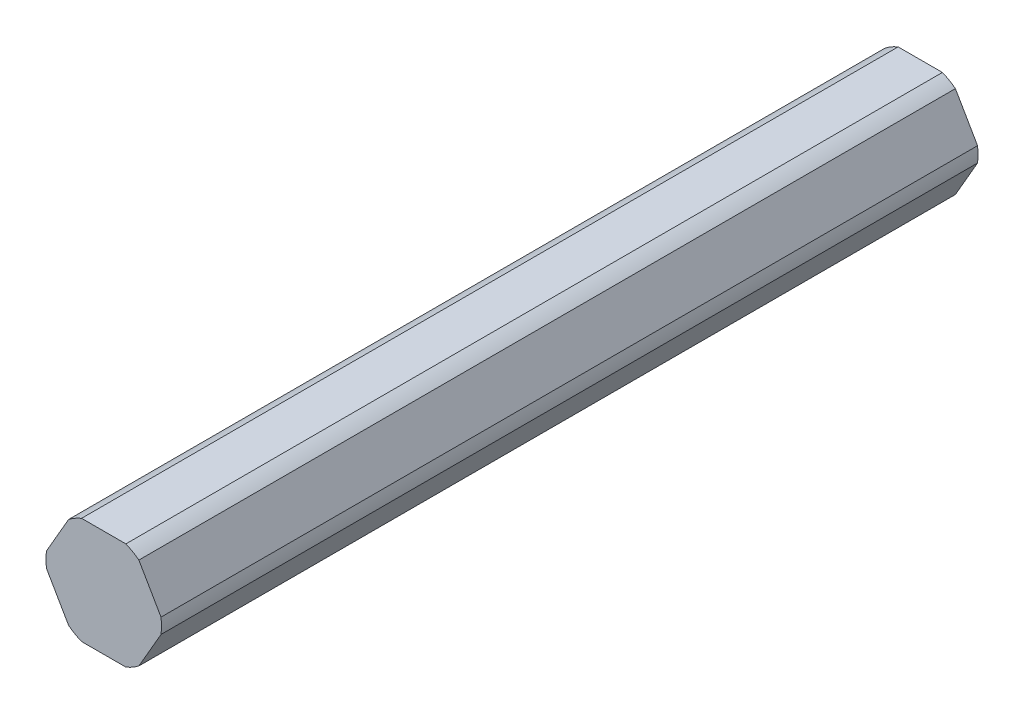
ISO-10303-21;
HEADER;
FILE_DESCRIPTION(('STEP AP214'),'2;1');
FILE_NAME('part.step','',(''),(''),'','','');
FILE_SCHEMA(('AUTOMOTIVE_DESIGN { 1 0 10303 214 1 1 1 1 }'));
ENDSEC;
DATA;
#1=APPLICATION_CONTEXT('core data for automotive mechanical design processes');
#2=APPLICATION_PROTOCOL_DEFINITION('international standard','automotive_design',2000,#1);
#3=PRODUCT_CONTEXT('',#1,'mechanical');
#4=PRODUCT('Part','Part','',(#3));
#5=PRODUCT_RELATED_PRODUCT_CATEGORY('part','',(#4));
#6=PRODUCT_DEFINITION_FORMATION('','',#4);
#7=PRODUCT_DEFINITION_CONTEXT('part definition',#1,'design');
#8=PRODUCT_DEFINITION('design','',#6,#7);
#9=PRODUCT_DEFINITION_SHAPE('','',#8);
#10=(LENGTH_UNIT() NAMED_UNIT(*) SI_UNIT(.MILLI.,.METRE.));
#11=(NAMED_UNIT(*) PLANE_ANGLE_UNIT() SI_UNIT($,.RADIAN.));
#12=(NAMED_UNIT(*) SI_UNIT($,.STERADIAN.) SOLID_ANGLE_UNIT());
#13=UNCERTAINTY_MEASURE_WITH_UNIT(LENGTH_MEASURE(1.E-05),#10,'distance_accuracy_value','');
#14=(GEOMETRIC_REPRESENTATION_CONTEXT(3) GLOBAL_UNCERTAINTY_ASSIGNED_CONTEXT((#13)) GLOBAL_UNIT_ASSIGNED_CONTEXT((#10,
#11,#12)) REPRESENTATION_CONTEXT('',''));
#15=CARTESIAN_POINT('',(0.,0.,0.));
#16=DIRECTION('',(0.,0.,1.));
#17=DIRECTION('',(1.,0.,0.));
#18=AXIS2_PLACEMENT_3D('',#15,#16,#17);
#19=CARTESIAN_POINT('',(0.,0.,0.));
#20=DIRECTION('',(0.,0.,1.));
#21=DIRECTION('',(1.,0.,0.));
#22=AXIS2_PLACEMENT_3D('',#19,#20,#21);
#23=PLANE('',#22);
#24=CARTESIAN_POINT('',(0.,0.,0.));
#25=DIRECTION('',(0.,0.,1.));
#26=DIRECTION('',(1.,0.,0.));
#27=AXIS2_PLACEMENT_3D('',#24,#25,#26);
#28=CIRCLE('',#27,6.875);
#29=CARTESIAN_POINT('',(-6.816751826331,0.893039494206723,0.));
#30=VERTEX_POINT('',#29);
#31=CARTESIAN_POINT('',(-6.81675182633098,-0.893039494206822,0.));
#32=VERTEX_POINT('',#31);
#33=EDGE_CURVE('E122',#30,#32,#28,.T.);
#34=ORIENTED_EDGE('',*,*,#33,.F.);
#35=DIRECTION('',(-0.499999999999995,-0.866025403784442,0.));
#36=VECTOR('',#35,1.);
#37=CARTESIAN_POINT('',(-3.66617420935415,6.34999999999997,0.));
#38=LINE('',#37,#36);
#39=CARTESIAN_POINT('',(-4.18177080173139,5.4569605057932,0.));
#40=VERTEX_POINT('',#39);
#41=EDGE_CURVE('E134',#40,#30,#38,.T.);
#42=ORIENTED_EDGE('',*,*,#41,.F.);
#43=CARTESIAN_POINT('',(0.,0.,0.));
#44=DIRECTION('',(0.,0.,1.));
#45=DIRECTION('',(1.,0.,0.));
#46=AXIS2_PLACEMENT_3D('',#43,#44,#45);
#47=CIRCLE('',#46,6.875);
#48=CARTESIAN_POINT('',(-2.63498102459966,6.34999999999998,0.));
#49=VERTEX_POINT('',#48);
#50=EDGE_CURVE('E162',#49,#40,#47,.T.);
#51=ORIENTED_EDGE('',*,*,#50,.F.);
#52=DIRECTION('',(-1.,0.,0.));
#53=VECTOR('',#52,1.);
#54=CARTESIAN_POINT('',(3.6661742093541,6.35,0.));
#55=LINE('',#54,#53);
#56=CARTESIAN_POINT('',(2.63498102459961,6.35,0.));
#57=VERTEX_POINT('',#56);
#58=EDGE_CURVE('E140',#57,#49,#55,.T.);
#59=ORIENTED_EDGE('',*,*,#58,.F.);
#60=CARTESIAN_POINT('',(0.,0.,0.));
#61=DIRECTION('',(0.,0.,1.));
#62=DIRECTION('',(1.,0.,0.));
#63=AXIS2_PLACEMENT_3D('',#60,#61,#62);
#64=CIRCLE('',#63,6.875);
#65=CARTESIAN_POINT('',(4.18177080173135,5.45696050579323,0.));
#66=VERTEX_POINT('',#65);
#67=EDGE_CURVE('E172',#66,#57,#64,.T.);
#68=ORIENTED_EDGE('',*,*,#67,.F.);
#69=DIRECTION('',(-0.500000000000001,0.866025403784438,0.));
#70=VECTOR('',#69,1.);
#71=CARTESIAN_POINT('',(7.33234841870824,0.,0.));
#72=LINE('',#71,#70);
#73=CARTESIAN_POINT('',(6.81675182633099,0.893039494206768,0.));
#74=VERTEX_POINT('',#73);
#75=EDGE_CURVE('E142',#74,#66,#72,.T.);
#76=ORIENTED_EDGE('',*,*,#75,.F.);
#77=CARTESIAN_POINT('',(0.,0.,0.));
#78=DIRECTION('',(0.,0.,1.));
#79=DIRECTION('',(1.,0.,0.));
#80=AXIS2_PLACEMENT_3D('',#77,#78,#79);
#81=CIRCLE('',#80,6.875);
#82=CARTESIAN_POINT('',(6.81675182633099,-0.893039494206787,0.));
#83=VERTEX_POINT('',#82);
#84=EDGE_CURVE('E182',#83,#74,#81,.T.);
#85=ORIENTED_EDGE('',*,*,#84,.F.);
#86=DIRECTION('',(0.499999999999995,0.866025403784441,0.));
#87=VECTOR('',#86,1.);
#88=CARTESIAN_POINT('',(3.66617420935419,-6.34999999999995,0.));
#89=LINE('',#88,#87);
#90=CARTESIAN_POINT('',(4.18177080173144,-5.45696050579316,0.));
#91=VERTEX_POINT('',#90);
#92=EDGE_CURVE('E146',#91,#83,#89,.T.);
#93=ORIENTED_EDGE('',*,*,#92,.F.);
#94=CARTESIAN_POINT('',(0.,0.,0.));
#95=DIRECTION('',(0.,0.,1.));
#96=DIRECTION('',(1.,0.,0.));
#97=AXIS2_PLACEMENT_3D('',#94,#95,#96);
#98=CIRCLE('',#97,6.875);
#99=CARTESIAN_POINT('',(2.6349810245997,-6.34999999999996,0.));
#100=VERTEX_POINT('',#99);
#101=EDGE_CURVE('E192',#100,#91,#98,.T.);
#102=ORIENTED_EDGE('',*,*,#101,.F.);
#103=DIRECTION('',(1.,0.,0.));
#104=VECTOR('',#103,1.);
#105=CARTESIAN_POINT('',(-3.66617420935406,-6.35000000000002,0.));
#106=LINE('',#105,#104);
#107=CARTESIAN_POINT('',(-2.63498102459957,-6.35000000000002,0.));
#108=VERTEX_POINT('',#107);
#109=EDGE_CURVE('E11',#108,#100,#106,.T.);
#110=ORIENTED_EDGE('',*,*,#109,.F.);
#111=CARTESIAN_POINT('',(0.,0.,0.));
#112=DIRECTION('',(0.,0.,1.));
#113=DIRECTION('',(1.,0.,0.));
#114=AXIS2_PLACEMENT_3D('',#111,#112,#113);
#115=CIRCLE('',#114,6.875);
#116=CARTESIAN_POINT('',(-4.18177080173132,-5.45696050579325,0.));
#117=VERTEX_POINT('',#116);
#118=EDGE_CURVE('E202',#117,#108,#115,.T.);
#119=ORIENTED_EDGE('',*,*,#118,.F.);
#120=DIRECTION('',(0.500000000000007,-0.866025403784435,0.));
#121=VECTOR('',#120,1.);
#122=CARTESIAN_POINT('',(-7.33234841870824,0.,0.));
#123=LINE('',#122,#121);
#124=EDGE_CURVE('E41',#32,#117,#123,.T.);
#125=ORIENTED_EDGE('',*,*,#124,.F.);
#126=EDGE_LOOP('',(#34,#42,#51,#59,#68,#76,#85,#93,#102,#110,#119,#125));
#127=FACE_BOUND('',#126,.T.);
#128=ADVANCED_FACE('F33',(#127),#23,.F.);
#129=CARTESIAN_POINT('',(0.,0.,97.155));
#130=DIRECTION('',(0.,0.,1.));
#131=DIRECTION('',(1.,0.,0.));
#132=AXIS2_PLACEMENT_3D('',#129,#130,#131);
#133=PLANE('',#132);
#134=DIRECTION('',(-0.499999999999995,-0.866025403784442,0.));
#135=VECTOR('',#134,1.);
#136=CARTESIAN_POINT('',(-3.66617420935415,6.34999999999997,97.155));
#137=LINE('',#136,#135);
#138=CARTESIAN_POINT('',(-4.18177080173139,5.4569605057932,97.155));
#139=VERTEX_POINT('',#138);
#140=CARTESIAN_POINT('',(-6.816751826331,0.893039494206722,97.155));
#141=VERTEX_POINT('',#140);
#142=EDGE_CURVE('E151',#139,#141,#137,.T.);
#143=ORIENTED_EDGE('',*,*,#142,.T.);
#144=CARTESIAN_POINT('',(0.,0.,97.155));
#145=DIRECTION('',(0.,0.,1.));
#146=DIRECTION('',(1.,0.,0.));
#147=AXIS2_PLACEMENT_3D('',#144,#145,#146);
#148=CIRCLE('',#147,6.875);
#149=CARTESIAN_POINT('',(-6.81675182633098,-0.893039494206822,97.155));
#150=VERTEX_POINT('',#149);
#151=EDGE_CURVE('E48',#141,#150,#148,.T.);
#152=ORIENTED_EDGE('',*,*,#151,.T.);
#153=DIRECTION('',(0.500000000000007,-0.866025403784435,0.));
#154=VECTOR('',#153,1.);
#155=CARTESIAN_POINT('',(-7.33234841870824,0.,97.155));
#156=LINE('',#155,#154);
#157=CARTESIAN_POINT('',(-4.18177080173132,-5.45696050579326,97.155));
#158=VERTEX_POINT('',#157);
#159=EDGE_CURVE('E55',#150,#158,#156,.T.);
#160=ORIENTED_EDGE('',*,*,#159,.T.);
#161=CARTESIAN_POINT('',(0.,0.,97.155));
#162=DIRECTION('',(0.,0.,1.));
#163=DIRECTION('',(1.,0.,0.));
#164=AXIS2_PLACEMENT_3D('',#161,#162,#163);
#165=CIRCLE('',#164,6.875);
#166=CARTESIAN_POINT('',(-2.63498102459957,-6.35000000000002,97.155));
#167=VERTEX_POINT('',#166);
#168=EDGE_CURVE('E204',#158,#167,#165,.T.);
#169=ORIENTED_EDGE('',*,*,#168,.T.);
#170=DIRECTION('',(1.,0.,0.));
#171=VECTOR('',#170,1.);
#172=CARTESIAN_POINT('',(-3.66617420935406,-6.35000000000003,97.155));
#173=LINE('',#172,#171);
#174=CARTESIAN_POINT('',(2.6349810245997,-6.34999999999996,97.155));
#175=VERTEX_POINT('',#174);
#176=EDGE_CURVE('E148',#167,#175,#173,.T.);
#177=ORIENTED_EDGE('',*,*,#176,.T.);
#178=CARTESIAN_POINT('',(0.,0.,97.155));
#179=DIRECTION('',(0.,0.,1.));
#180=DIRECTION('',(1.,0.,0.));
#181=AXIS2_PLACEMENT_3D('',#178,#179,#180);
#182=CIRCLE('',#181,6.875);
#183=CARTESIAN_POINT('',(4.18177080173144,-5.45696050579316,97.155));
#184=VERTEX_POINT('',#183);
#185=EDGE_CURVE('E194',#175,#184,#182,.T.);
#186=ORIENTED_EDGE('',*,*,#185,.T.);
#187=DIRECTION('',(0.499999999999995,0.866025403784442,0.));
#188=VECTOR('',#187,1.);
#189=CARTESIAN_POINT('',(3.66617420935419,-6.34999999999995,97.155));
#190=LINE('',#189,#188);
#191=CARTESIAN_POINT('',(6.81675182633099,-0.893039494206785,97.155));
#192=VERTEX_POINT('',#191);
#193=EDGE_CURVE('E157',#184,#192,#190,.T.);
#194=ORIENTED_EDGE('',*,*,#193,.T.);
#195=CARTESIAN_POINT('',(0.,0.,97.155));
#196=DIRECTION('',(0.,0.,1.));
#197=DIRECTION('',(1.,0.,0.));
#198=AXIS2_PLACEMENT_3D('',#195,#196,#197);
#199=CIRCLE('',#198,6.875);
#200=CARTESIAN_POINT('',(6.81675182633099,0.893039494206768,97.155));
#201=VERTEX_POINT('',#200);
#202=EDGE_CURVE('E184',#192,#201,#199,.T.);
#203=ORIENTED_EDGE('',*,*,#202,.T.);
#204=DIRECTION('',(-0.500000000000001,0.866025403784438,0.));
#205=VECTOR('',#204,1.);
#206=CARTESIAN_POINT('',(7.33234841870824,0.,97.155));
#207=LINE('',#206,#205);
#208=CARTESIAN_POINT('',(4.18177080173135,5.45696050579323,97.155));
#209=VERTEX_POINT('',#208);
#210=EDGE_CURVE('E155',#201,#209,#207,.T.);
#211=ORIENTED_EDGE('',*,*,#210,.T.);
#212=CARTESIAN_POINT('',(0.,0.,97.155));
#213=DIRECTION('',(0.,0.,1.));
#214=DIRECTION('',(1.,0.,0.));
#215=AXIS2_PLACEMENT_3D('',#212,#213,#214);
#216=CIRCLE('',#215,6.875);
#217=CARTESIAN_POINT('',(2.63498102459961,6.35,97.155));
#218=VERTEX_POINT('',#217);
#219=EDGE_CURVE('E174',#209,#218,#216,.T.);
#220=ORIENTED_EDGE('',*,*,#219,.T.);
#221=DIRECTION('',(-1.,0.,0.));
#222=VECTOR('',#221,1.);
#223=CARTESIAN_POINT('',(3.6661742093541,6.35,97.155));
#224=LINE('',#223,#222);
#225=CARTESIAN_POINT('',(-2.63498102459966,6.34999999999998,97.155));
#226=VERTEX_POINT('',#225);
#227=EDGE_CURVE('E153',#218,#226,#224,.T.);
#228=ORIENTED_EDGE('',*,*,#227,.T.);
#229=CARTESIAN_POINT('',(0.,0.,97.155));
#230=DIRECTION('',(0.,0.,1.));
#231=DIRECTION('',(1.,0.,0.));
#232=AXIS2_PLACEMENT_3D('',#229,#230,#231);
#233=CIRCLE('',#232,6.875);
#234=EDGE_CURVE('E164',#226,#139,#233,.T.);
#235=ORIENTED_EDGE('',*,*,#234,.T.);
#236=EDGE_LOOP('',(#143,#152,#160,#169,#177,#186,#194,#203,#211,#220,#228,#235));
#237=FACE_BOUND('',#236,.T.);
#238=ADVANCED_FACE('F208',(#237),#133,.T.);
#239=CARTESIAN_POINT('',(-7.33234841870824,0.,7.9375));
#240=DIRECTION('',(0.866025403784435,0.500000000000007,0.));
#241=DIRECTION('',(-0.500000000000007,0.866025403784435,0.));
#242=AXIS2_PLACEMENT_3D('',#239,#240,#241);
#243=PLANE('',#242);
#244=DIRECTION('',(0.,0.,1.));
#245=VECTOR('',#244,1.);
#246=CARTESIAN_POINT('',(-6.81675182633098,-0.893039494206822,0.));
#247=LINE('',#246,#245);
#248=EDGE_CURVE('E128',#32,#150,#247,.T.);
#249=ORIENTED_EDGE('',*,*,#248,.F.);
#250=ORIENTED_EDGE('',*,*,#124,.T.);
#251=DIRECTION('',(0.,0.,1.));
#252=VECTOR('',#251,1.);
#253=CARTESIAN_POINT('',(-4.18177080173132,-5.45696050579325,0.));
#254=LINE('',#253,#252);
#255=EDGE_CURVE('E199',#117,#158,#254,.T.);
#256=ORIENTED_EDGE('',*,*,#255,.T.);
#257=ORIENTED_EDGE('',*,*,#159,.F.);
#258=EDGE_LOOP('',(#249,#250,#256,#257));
#259=FACE_BOUND('',#258,.T.);
#260=ADVANCED_FACE('F210',(#259),#243,.F.);
#261=CARTESIAN_POINT('',(-3.66617420935415,6.34999999999997,7.9375));
#262=DIRECTION('',(0.866025403784442,-0.499999999999995,0.));
#263=DIRECTION('',(0.499999999999995,0.866025403784442,0.));
#264=AXIS2_PLACEMENT_3D('',#261,#262,#263);
#265=PLANE('',#264);
#266=DIRECTION('',(0.,0.,1.));
#267=VECTOR('',#266,1.);
#268=CARTESIAN_POINT('',(-6.816751826331,0.893039494206723,0.));
#269=LINE('',#268,#267);
#270=EDGE_CURVE('E119',#30,#141,#269,.T.);
#271=ORIENTED_EDGE('',*,*,#270,.T.);
#272=ORIENTED_EDGE('',*,*,#142,.F.);
#273=DIRECTION('',(0.,0.,1.));
#274=VECTOR('',#273,1.);
#275=CARTESIAN_POINT('',(-4.18177080173139,5.4569605057932,0.));
#276=LINE('',#275,#274);
#277=EDGE_CURVE('E139',#40,#139,#276,.T.);
#278=ORIENTED_EDGE('',*,*,#277,.F.);
#279=ORIENTED_EDGE('',*,*,#41,.T.);
#280=EDGE_LOOP('',(#271,#272,#278,#279));
#281=FACE_BOUND('',#280,.T.);
#282=ADVANCED_FACE('F138',(#281),#265,.F.);
#283=CARTESIAN_POINT('',(-3.66617420935406,-6.35000000000002,7.9375));
#284=DIRECTION('',(0.,1.,0.));
#285=DIRECTION('',(-1.,0.,0.));
#286=AXIS2_PLACEMENT_3D('',#283,#284,#285);
#287=PLANE('',#286);
#288=DIRECTION('',(0.,0.,1.));
#289=VECTOR('',#288,1.);
#290=CARTESIAN_POINT('',(-2.63498102459957,-6.35000000000002,0.));
#291=LINE('',#290,#289);
#292=EDGE_CURVE('E197',#108,#167,#291,.T.);
#293=ORIENTED_EDGE('',*,*,#292,.F.);
#294=ORIENTED_EDGE('',*,*,#109,.T.);
#295=DIRECTION('',(0.,0.,1.));
#296=VECTOR('',#295,1.);
#297=CARTESIAN_POINT('',(2.6349810245997,-6.34999999999996,0.));
#298=LINE('',#297,#296);
#299=EDGE_CURVE('E189',#100,#175,#298,.T.);
#300=ORIENTED_EDGE('',*,*,#299,.T.);
#301=ORIENTED_EDGE('',*,*,#176,.F.);
#302=EDGE_LOOP('',(#293,#294,#300,#301));
#303=FACE_BOUND('',#302,.T.);
#304=ADVANCED_FACE('F220',(#303),#287,.F.);
#305=CARTESIAN_POINT('',(3.66617420935419,-6.34999999999995,7.9375));
#306=DIRECTION('',(-0.866025403784441,0.499999999999995,0.));
#307=DIRECTION('',(-0.499999999999995,-0.866025403784442,0.));
#308=AXIS2_PLACEMENT_3D('',#305,#306,#307);
#309=PLANE('',#308);
#310=DIRECTION('',(0.,0.,1.));
#311=VECTOR('',#310,1.);
#312=CARTESIAN_POINT('',(4.18177080173144,-5.45696050579316,0.));
#313=LINE('',#312,#311);
#314=EDGE_CURVE('E187',#91,#184,#313,.T.);
#315=ORIENTED_EDGE('',*,*,#314,.F.);
#316=ORIENTED_EDGE('',*,*,#92,.T.);
#317=DIRECTION('',(0.,0.,1.));
#318=VECTOR('',#317,1.);
#319=CARTESIAN_POINT('',(6.81675182633099,-0.893039494206787,0.));
#320=LINE('',#319,#318);
#321=EDGE_CURVE('E179',#83,#192,#320,.T.);
#322=ORIENTED_EDGE('',*,*,#321,.T.);
#323=ORIENTED_EDGE('',*,*,#193,.F.);
#324=EDGE_LOOP('',(#315,#316,#322,#323));
#325=FACE_BOUND('',#324,.T.);
#326=ADVANCED_FACE('F35',(#325),#309,.F.);
#327=CARTESIAN_POINT('',(7.33234841870824,0.,7.9375));
#328=DIRECTION('',(-0.866025403784438,-0.500000000000001,0.));
#329=DIRECTION('',(0.500000000000001,-0.866025403784438,0.));
#330=AXIS2_PLACEMENT_3D('',#327,#328,#329);
#331=PLANE('',#330);
#332=DIRECTION('',(0.,0.,1.));
#333=VECTOR('',#332,1.);
#334=CARTESIAN_POINT('',(6.81675182633099,0.893039494206768,0.));
#335=LINE('',#334,#333);
#336=EDGE_CURVE('E177',#74,#201,#335,.T.);
#337=ORIENTED_EDGE('',*,*,#336,.F.);
#338=ORIENTED_EDGE('',*,*,#75,.T.);
#339=DIRECTION('',(0.,0.,1.));
#340=VECTOR('',#339,1.);
#341=CARTESIAN_POINT('',(4.18177080173135,5.45696050579323,0.));
#342=LINE('',#341,#340);
#343=EDGE_CURVE('E169',#66,#209,#342,.T.);
#344=ORIENTED_EDGE('',*,*,#343,.T.);
#345=ORIENTED_EDGE('',*,*,#210,.F.);
#346=EDGE_LOOP('',(#337,#338,#344,#345));
#347=FACE_BOUND('',#346,.T.);
#348=ADVANCED_FACE('F239',(#347),#331,.F.);
#349=CARTESIAN_POINT('',(3.6661742093541,6.35,7.9375));
#350=DIRECTION('',(0.,-1.,0.));
#351=DIRECTION('',(1.,0.,0.));
#352=AXIS2_PLACEMENT_3D('',#349,#350,#351);
#353=PLANE('',#352);
#354=DIRECTION('',(0.,0.,1.));
#355=VECTOR('',#354,1.);
#356=CARTESIAN_POINT('',(2.63498102459961,6.35,0.));
#357=LINE('',#356,#355);
#358=EDGE_CURVE('E167',#57,#218,#357,.T.);
#359=ORIENTED_EDGE('',*,*,#358,.F.);
#360=ORIENTED_EDGE('',*,*,#58,.T.);
#361=DIRECTION('',(0.,0.,1.));
#362=VECTOR('',#361,1.);
#363=CARTESIAN_POINT('',(-2.63498102459966,6.34999999999998,0.));
#364=LINE('',#363,#362);
#365=EDGE_CURVE('E159',#49,#226,#364,.T.);
#366=ORIENTED_EDGE('',*,*,#365,.T.);
#367=ORIENTED_EDGE('',*,*,#227,.F.);
#368=EDGE_LOOP('',(#359,#360,#366,#367));
#369=FACE_BOUND('',#368,.T.);
#370=ADVANCED_FACE('F248',(#369),#353,.F.);
#371=CARTESIAN_POINT('',(0.,0.,0.));
#372=DIRECTION('',(0.,0.,1.));
#373=DIRECTION('',(1.,0.,0.));
#374=AXIS2_PLACEMENT_3D('',#371,#372,#373);
#375=CYLINDRICAL_SURFACE('',#374,6.875);
#376=ORIENTED_EDGE('',*,*,#234,.F.);
#377=ORIENTED_EDGE('',*,*,#365,.F.);
#378=ORIENTED_EDGE('',*,*,#50,.T.);
#379=ORIENTED_EDGE('',*,*,#277,.T.);
#380=EDGE_LOOP('',(#376,#377,#378,#379));
#381=FACE_BOUND('',#380,.T.);
#382=ADVANCED_FACE('F251',(#381),#375,.T.);
#383=CARTESIAN_POINT('',(0.,0.,0.));
#384=DIRECTION('',(0.,0.,1.));
#385=DIRECTION('',(1.,0.,0.));
#386=AXIS2_PLACEMENT_3D('',#383,#384,#385);
#387=CYLINDRICAL_SURFACE('',#386,6.875);
#388=ORIENTED_EDGE('',*,*,#219,.F.);
#389=ORIENTED_EDGE('',*,*,#343,.F.);
#390=ORIENTED_EDGE('',*,*,#67,.T.);
#391=ORIENTED_EDGE('',*,*,#358,.T.);
#392=EDGE_LOOP('',(#388,#389,#390,#391));
#393=FACE_BOUND('',#392,.T.);
#394=ADVANCED_FACE('F243',(#393),#387,.T.);
#395=CARTESIAN_POINT('',(0.,0.,0.));
#396=DIRECTION('',(0.,0.,1.));
#397=DIRECTION('',(1.,0.,0.));
#398=AXIS2_PLACEMENT_3D('',#395,#396,#397);
#399=CYLINDRICAL_SURFACE('',#398,6.875);
#400=ORIENTED_EDGE('',*,*,#202,.F.);
#401=ORIENTED_EDGE('',*,*,#321,.F.);
#402=ORIENTED_EDGE('',*,*,#84,.T.);
#403=ORIENTED_EDGE('',*,*,#336,.T.);
#404=EDGE_LOOP('',(#400,#401,#402,#403));
#405=FACE_BOUND('',#404,.T.);
#406=ADVANCED_FACE('F232',(#405),#399,.T.);
#407=CARTESIAN_POINT('',(0.,0.,0.));
#408=DIRECTION('',(0.,0.,1.));
#409=DIRECTION('',(1.,0.,0.));
#410=AXIS2_PLACEMENT_3D('',#407,#408,#409);
#411=CYLINDRICAL_SURFACE('',#410,6.875);
#412=ORIENTED_EDGE('',*,*,#185,.F.);
#413=ORIENTED_EDGE('',*,*,#299,.F.);
#414=ORIENTED_EDGE('',*,*,#101,.T.);
#415=ORIENTED_EDGE('',*,*,#314,.T.);
#416=EDGE_LOOP('',(#412,#413,#414,#415));
#417=FACE_BOUND('',#416,.T.);
#418=ADVANCED_FACE('F224',(#417),#411,.T.);
#419=CARTESIAN_POINT('',(0.,0.,0.));
#420=DIRECTION('',(0.,0.,1.));
#421=DIRECTION('',(1.,0.,0.));
#422=AXIS2_PLACEMENT_3D('',#419,#420,#421);
#423=CYLINDRICAL_SURFACE('',#422,6.875);
#424=ORIENTED_EDGE('',*,*,#168,.F.);
#425=ORIENTED_EDGE('',*,*,#255,.F.);
#426=ORIENTED_EDGE('',*,*,#118,.T.);
#427=ORIENTED_EDGE('',*,*,#292,.T.);
#428=EDGE_LOOP('',(#424,#425,#426,#427));
#429=FACE_BOUND('',#428,.T.);
#430=ADVANCED_FACE('F213',(#429),#423,.T.);
#431=CARTESIAN_POINT('',(0.,0.,0.));
#432=DIRECTION('',(0.,0.,1.));
#433=DIRECTION('',(1.,0.,0.));
#434=AXIS2_PLACEMENT_3D('',#431,#432,#433);
#435=CYLINDRICAL_SURFACE('',#434,6.875);
#436=ORIENTED_EDGE('',*,*,#151,.F.);
#437=ORIENTED_EDGE('',*,*,#270,.F.);
#438=ORIENTED_EDGE('',*,*,#33,.T.);
#439=ORIENTED_EDGE('',*,*,#248,.T.);
#440=EDGE_LOOP('',(#436,#437,#438,#439));
#441=FACE_BOUND('',#440,.T.);
#442=ADVANCED_FACE('F121',(#441),#435,.T.);
#443=CLOSED_SHELL('',(#128,#238,#260,#282,#304,#326,#348,#370,#382,#394,#406,#418,#430,#442));
#444=MANIFOLD_SOLID_BREP('B2',#443);
#445=ADVANCED_BREP_SHAPE_REPRESENTATION('',(#18,#444),#14);
#446=SHAPE_DEFINITION_REPRESENTATION(#9,#445);
ENDSEC;
END-ISO-10303-21;
